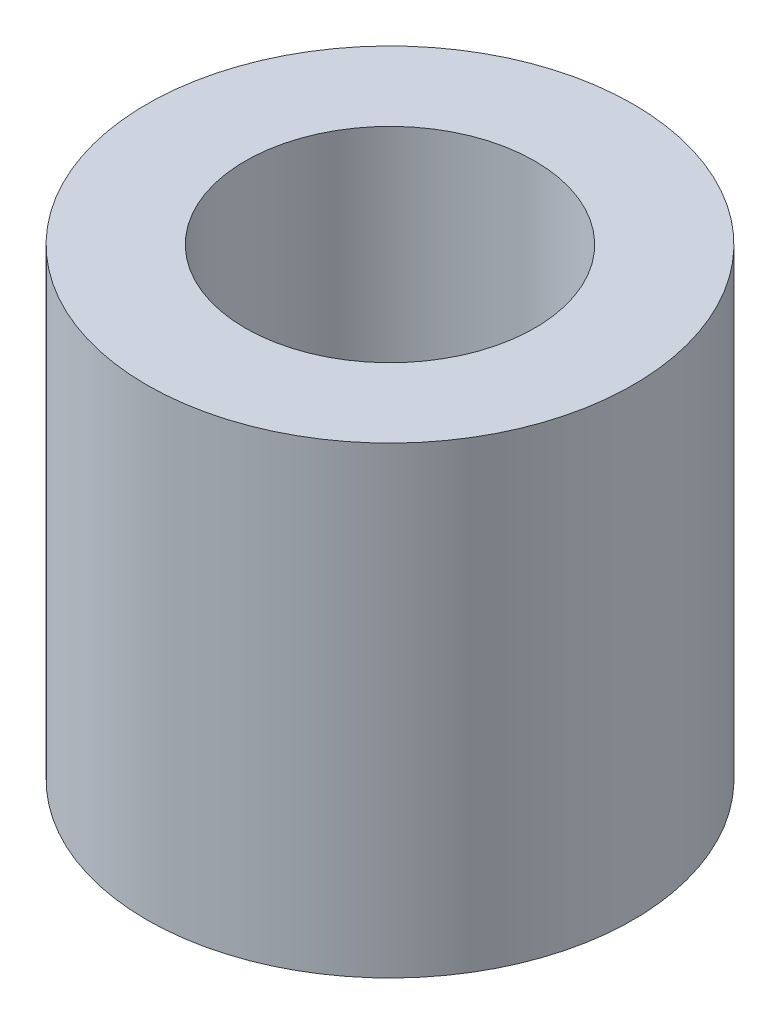
ISO-10303-21;
HEADER;
FILE_DESCRIPTION(('STEP AP214'),'2;1');
FILE_NAME('part.step','',(''),(''),'','','');
FILE_SCHEMA(('AUTOMOTIVE_DESIGN { 1 0 10303 214 1 1 1 1 }'));
ENDSEC;
DATA;
#1=APPLICATION_CONTEXT('core data for automotive mechanical design processes');
#2=APPLICATION_PROTOCOL_DEFINITION('international standard','automotive_design',2000,#1);
#3=PRODUCT_CONTEXT('',#1,'mechanical');
#4=PRODUCT('Part','Part','',(#3));
#5=PRODUCT_RELATED_PRODUCT_CATEGORY('part','',(#4));
#6=PRODUCT_DEFINITION_FORMATION('','',#4);
#7=PRODUCT_DEFINITION_CONTEXT('part definition',#1,'design');
#8=PRODUCT_DEFINITION('design','',#6,#7);
#9=PRODUCT_DEFINITION_SHAPE('','',#8);
#10=(LENGTH_UNIT() NAMED_UNIT(*) SI_UNIT(.MILLI.,.METRE.));
#11=(NAMED_UNIT(*) PLANE_ANGLE_UNIT() SI_UNIT($,.RADIAN.));
#12=(NAMED_UNIT(*) SI_UNIT($,.STERADIAN.) SOLID_ANGLE_UNIT());
#13=UNCERTAINTY_MEASURE_WITH_UNIT(LENGTH_MEASURE(1.E-05),#10,'distance_accuracy_value','');
#14=(GEOMETRIC_REPRESENTATION_CONTEXT(3) GLOBAL_UNCERTAINTY_ASSIGNED_CONTEXT((#13)) GLOBAL_UNIT_ASSIGNED_CONTEXT((#10,
#11,#12)) REPRESENTATION_CONTEXT('',''));
#15=CARTESIAN_POINT('',(0.,0.,0.));
#16=DIRECTION('',(0.,0.,1.));
#17=DIRECTION('',(1.,0.,0.));
#18=AXIS2_PLACEMENT_3D('',#15,#16,#17);
#19=CARTESIAN_POINT('',(0.,4.,0.));
#20=DIRECTION('',(0.,-1.,0.));
#21=DIRECTION('',(0.,0.,-1.));
#22=AXIS2_PLACEMENT_3D('',#19,#20,#21);
#23=CYLINDRICAL_SURFACE('',#22,2.1);
#24=CARTESIAN_POINT('',(0.,4.,0.));
#25=DIRECTION('',(0.,1.,0.));
#26=DIRECTION('',(0.,0.,1.));
#27=AXIS2_PLACEMENT_3D('',#24,#25,#26);
#28=CIRCLE('',#27,2.1);
#29=CARTESIAN_POINT('',(0.,4.,2.1));
#30=VERTEX_POINT('',#29);
#31=EDGE_CURVE('E10',#30,#30,#28,.T.);
#32=ORIENTED_EDGE('',*,*,#31,.F.);
#33=EDGE_LOOP('',(#32));
#34=FACE_BOUND('',#33,.T.);
#35=CARTESIAN_POINT('',(0.,0.,0.));
#36=DIRECTION('',(0.,1.,0.));
#37=DIRECTION('',(0.,0.,1.));
#38=AXIS2_PLACEMENT_3D('',#35,#36,#37);
#39=CIRCLE('',#38,2.1);
#40=CARTESIAN_POINT('',(0.,0.,2.1));
#41=VERTEX_POINT('',#40);
#42=EDGE_CURVE('E39',#41,#41,#39,.T.);
#43=ORIENTED_EDGE('',*,*,#42,.T.);
#44=EDGE_LOOP('',(#43));
#45=FACE_BOUND('',#44,.T.);
#46=ADVANCED_FACE('F36',(#34,#45),#23,.T.);
#47=CARTESIAN_POINT('',(0.,4.,0.));
#48=DIRECTION('',(0.,1.,0.));
#49=DIRECTION('',(0.,0.,1.));
#50=AXIS2_PLACEMENT_3D('',#47,#48,#49);
#51=PLANE('',#50);
#52=CARTESIAN_POINT('',(0.,4.,0.));
#53=DIRECTION('',(0.,1.,0.));
#54=DIRECTION('',(0.,0.,1.));
#55=AXIS2_PLACEMENT_3D('',#52,#53,#54);
#56=CIRCLE('',#55,1.25);
#57=CARTESIAN_POINT('',(0.,4.,1.25));
#58=VERTEX_POINT('',#57);
#59=EDGE_CURVE('E50',#58,#58,#56,.T.);
#60=ORIENTED_EDGE('',*,*,#59,.F.);
#61=EDGE_LOOP('',(#60));
#62=FACE_BOUND('',#61,.T.);
#63=ORIENTED_EDGE('',*,*,#31,.T.);
#64=EDGE_LOOP('',(#63));
#65=FACE_BOUND('',#64,.T.);
#66=ADVANCED_FACE('F56',(#62,#65),#51,.T.);
#67=CARTESIAN_POINT('',(0.,0.,0.));
#68=DIRECTION('',(0.,1.,0.));
#69=DIRECTION('',(0.,0.,1.));
#70=AXIS2_PLACEMENT_3D('',#67,#68,#69);
#71=PLANE('',#70);
#72=CARTESIAN_POINT('',(0.,0.,0.));
#73=DIRECTION('',(0.,1.,0.));
#74=DIRECTION('',(0.,0.,1.));
#75=AXIS2_PLACEMENT_3D('',#72,#73,#74);
#76=CIRCLE('',#75,1.25);
#77=CARTESIAN_POINT('',(0.,0.,1.25));
#78=VERTEX_POINT('',#77);
#79=EDGE_CURVE('E46',#78,#78,#76,.T.);
#80=ORIENTED_EDGE('',*,*,#79,.T.);
#81=EDGE_LOOP('',(#80));
#82=FACE_BOUND('',#81,.T.);
#83=ORIENTED_EDGE('',*,*,#42,.F.);
#84=EDGE_LOOP('',(#83));
#85=FACE_BOUND('',#84,.T.);
#86=ADVANCED_FACE('F58',(#82,#85),#71,.F.);
#87=CARTESIAN_POINT('',(0.,4.,0.));
#88=DIRECTION('',(0.,1.,0.));
#89=DIRECTION('',(0.,0.,1.));
#90=AXIS2_PLACEMENT_3D('',#87,#88,#89);
#91=CYLINDRICAL_SURFACE('',#90,1.25);
#92=ORIENTED_EDGE('',*,*,#79,.F.);
#93=EDGE_LOOP('',(#92));
#94=FACE_BOUND('',#93,.T.);
#95=ORIENTED_EDGE('',*,*,#59,.T.);
#96=EDGE_LOOP('',(#95));
#97=FACE_BOUND('',#96,.T.);
#98=ADVANCED_FACE('F54',(#94,#97),#91,.F.);
#99=CLOSED_SHELL('',(#46,#66,#86,#98));
#100=MANIFOLD_SOLID_BREP('B2',#99);
#101=ADVANCED_BREP_SHAPE_REPRESENTATION('',(#18,#100),#14);
#102=SHAPE_DEFINITION_REPRESENTATION(#9,#101);
ENDSEC;
END-ISO-10303-21;
